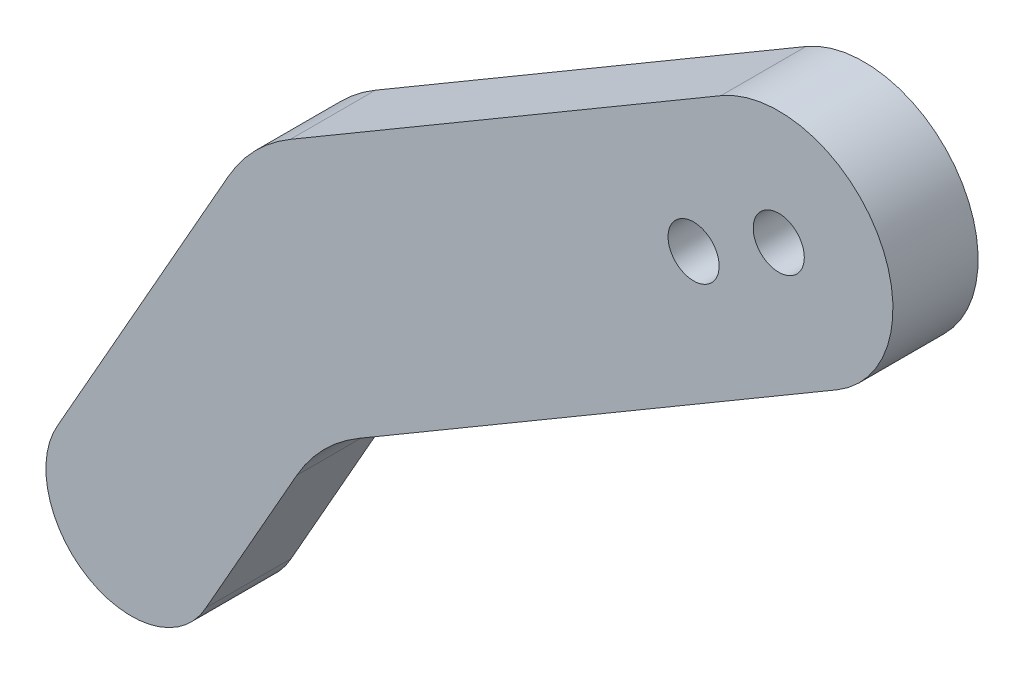
ISO-10303-21;
HEADER;
FILE_DESCRIPTION(('STEP AP214'),'2;1');
FILE_NAME('part.step','',(''),(''),'','','');
FILE_SCHEMA(('AUTOMOTIVE_DESIGN { 1 0 10303 214 1 1 1 1 }'));
ENDSEC;
DATA;
#1=APPLICATION_CONTEXT('core data for automotive mechanical design processes');
#2=APPLICATION_PROTOCOL_DEFINITION('international standard','automotive_design',2000,#1);
#3=PRODUCT_CONTEXT('',#1,'mechanical');
#4=PRODUCT('Part','Part','',(#3));
#5=PRODUCT_RELATED_PRODUCT_CATEGORY('part','',(#4));
#6=PRODUCT_DEFINITION_FORMATION('','',#4);
#7=PRODUCT_DEFINITION_CONTEXT('part definition',#1,'design');
#8=PRODUCT_DEFINITION('design','',#6,#7);
#9=PRODUCT_DEFINITION_SHAPE('','',#8);
#10=(LENGTH_UNIT() NAMED_UNIT(*) SI_UNIT(.MILLI.,.METRE.));
#11=(NAMED_UNIT(*) PLANE_ANGLE_UNIT() SI_UNIT($,.RADIAN.));
#12=(NAMED_UNIT(*) SI_UNIT($,.STERADIAN.) SOLID_ANGLE_UNIT());
#13=UNCERTAINTY_MEASURE_WITH_UNIT(LENGTH_MEASURE(1.E-05),#10,'distance_accuracy_value','');
#14=(GEOMETRIC_REPRESENTATION_CONTEXT(3) GLOBAL_UNCERTAINTY_ASSIGNED_CONTEXT((#13)) GLOBAL_UNIT_ASSIGNED_CONTEXT((#10,
#11,#12)) REPRESENTATION_CONTEXT('',''));
#15=CARTESIAN_POINT('',(0.,0.,0.));
#16=DIRECTION('',(0.,0.,1.));
#17=DIRECTION('',(1.,0.,0.));
#18=AXIS2_PLACEMENT_3D('',#15,#16,#17);
#19=CARTESIAN_POINT('',(8.69918007203384,-4.93196371380907,5.));
#20=DIRECTION('',(-0.869918007203384,0.493196371380907,0.));
#21=DIRECTION('',(-0.493196371380907,-0.869918007203384,0.));
#22=AXIS2_PLACEMENT_3D('',#19,#20,#21);
#23=PLANE('',#22);
#24=DIRECTION('',(0.493196371380907,0.869918007203384,0.));
#25=VECTOR('',#24,1.);
#26=CARTESIAN_POINT('',(8.69918007203384,-4.93196371380907,0.));
#27=LINE('',#26,#25);
#28=CARTESIAN_POINT('',(8.69918007203384,-4.93196371380907,0.));
#29=VERTEX_POINT('',#28);
#30=CARTESIAN_POINT('',(14.0358153914613,4.48099110832223,0.));
#31=VERTEX_POINT('',#30);
#32=EDGE_CURVE('E132',#29,#31,#27,.T.);
#33=ORIENTED_EDGE('',*,*,#32,.T.);
#34=DIRECTION('',(0.,0.,-1.));
#35=VECTOR('',#34,1.);
#36=CARTESIAN_POINT('',(14.0358153914613,4.48099110832223,5.));
#37=LINE('',#36,#35);
#38=CARTESIAN_POINT('',(14.0358153914613,4.48099110832223,5.));
#39=VERTEX_POINT('',#38);
#40=EDGE_CURVE('E11',#39,#31,#37,.T.);
#41=ORIENTED_EDGE('',*,*,#40,.F.);
#42=DIRECTION('',(0.493196371380907,0.869918007203384,0.));
#43=VECTOR('',#42,1.);
#44=CARTESIAN_POINT('',(8.69918007203384,-4.93196371380907,5.));
#45=LINE('',#44,#43);
#46=CARTESIAN_POINT('',(8.69918007203384,-4.93196371380907,5.));
#47=VERTEX_POINT('',#46);
#48=EDGE_CURVE('E151',#47,#39,#45,.T.);
#49=ORIENTED_EDGE('',*,*,#48,.F.);
#50=DIRECTION('',(0.,0.,-1.));
#51=VECTOR('',#50,1.);
#52=CARTESIAN_POINT('',(8.69918007203384,-4.93196371380907,5.));
#53=LINE('',#52,#51);
#54=EDGE_CURVE('E128',#47,#29,#53,.T.);
#55=ORIENTED_EDGE('',*,*,#54,.T.);
#56=EDGE_LOOP('',(#33,#41,#49,#55));
#57=FACE_BOUND('',#56,.T.);
#58=ADVANCED_FACE('F35',(#57),#23,.F.);
#59=CARTESIAN_POINT('',(22.7349954634952,-0.450972605486846,5.));
#60=DIRECTION('',(0.,0.,-1.));
#61=DIRECTION('',(-1.,0.,0.));
#62=AXIS2_PLACEMENT_3D('',#59,#60,#61);
#63=CYLINDRICAL_SURFACE('',#62,10.);
#64=CARTESIAN_POINT('',(22.7349954634952,-0.450972605486846,0.));
#65=DIRECTION('',(0.,0.,1.));
#66=DIRECTION('',(1.,0.,0.));
#67=AXIS2_PLACEMENT_3D('',#64,#65,#66);
#68=CIRCLE('',#67,10.);
#69=CARTESIAN_POINT('',(17.6672663859231,8.16982329723177,0.));
#70=VERTEX_POINT('',#69);
#71=EDGE_CURVE('E135',#31,#70,#68,.F.);
#72=ORIENTED_EDGE('',*,*,#71,.T.);
#73=DIRECTION('',(0.,0.,-1.));
#74=VECTOR('',#73,1.);
#75=CARTESIAN_POINT('',(17.6672663859231,8.16982329723177,5.));
#76=LINE('',#75,#74);
#77=CARTESIAN_POINT('',(17.6672663859231,8.16982329723177,5.));
#78=VERTEX_POINT('',#77);
#79=EDGE_CURVE('E44',#78,#70,#76,.T.);
#80=ORIENTED_EDGE('',*,*,#79,.F.);
#81=CARTESIAN_POINT('',(22.7349954634952,-0.450972605486846,5.));
#82=DIRECTION('',(0.,0.,1.));
#83=DIRECTION('',(1.,0.,0.));
#84=AXIS2_PLACEMENT_3D('',#81,#82,#83);
#85=CIRCLE('',#84,10.);
#86=EDGE_CURVE('E92',#39,#78,#85,.F.);
#87=ORIENTED_EDGE('',*,*,#86,.F.);
#88=ORIENTED_EDGE('',*,*,#40,.T.);
#89=EDGE_LOOP('',(#72,#80,#87,#88));
#90=FACE_BOUND('',#89,.T.);
#91=ADVANCED_FACE('F201',(#90),#63,.F.);
#92=CARTESIAN_POINT('',(0.968064993313359,-1.64679101826007,5.));
#93=DIRECTION('',(-0.506772907757211,0.862079590271862,0.));
#94=DIRECTION('',(-0.862079590271862,-0.506772907757211,0.));
#95=AXIS2_PLACEMENT_3D('',#92,#93,#94);
#96=PLANE('',#95);
#97=DIRECTION('',(0.862079590271862,0.506772907757211,0.));
#98=VECTOR('',#97,1.);
#99=CARTESIAN_POINT('',(0.968064993313359,-1.64679101826007,0.));
#100=LINE('',#99,#98);
#101=CARTESIAN_POINT('',(45.7260168629817,24.6641409075221,0.));
#102=VERTEX_POINT('',#101);
#103=EDGE_CURVE('E138',#70,#102,#100,.T.);
#104=ORIENTED_EDGE('',*,*,#103,.T.);
#105=DIRECTION('',(0.,0.,-1.));
#106=VECTOR('',#105,1.);
#107=CARTESIAN_POINT('',(45.7260168629817,24.6641409075221,5.));
#108=LINE('',#107,#106);
#109=CARTESIAN_POINT('',(45.7260168629817,24.6641409075221,5.));
#110=VERTEX_POINT('',#109);
#111=EDGE_CURVE('E157',#110,#102,#108,.T.);
#112=ORIENTED_EDGE('',*,*,#111,.F.);
#113=DIRECTION('',(0.862079590271862,0.506772907757211,0.));
#114=VECTOR('',#113,1.);
#115=CARTESIAN_POINT('',(0.968064993313359,-1.64679101826007,5.));
#116=LINE('',#115,#114);
#117=EDGE_CURVE('E174',#78,#110,#116,.T.);
#118=ORIENTED_EDGE('',*,*,#117,.F.);
#119=ORIENTED_EDGE('',*,*,#79,.T.);
#120=EDGE_LOOP('',(#104,#112,#118,#119));
#121=FACE_BOUND('',#120,.T.);
#122=ADVANCED_FACE('F205',(#121),#96,.F.);
#123=CARTESIAN_POINT('',(42.3280401467211,30.4444940607153,5.));
#124=DIRECTION('',(0.,0.,-1.));
#125=DIRECTION('',(-1.,0.,0.));
#126=AXIS2_PLACEMENT_3D('',#123,#124,#125);
#127=CYLINDRICAL_SURFACE('',#126,6.70512701892218);
#128=CARTESIAN_POINT('',(42.3280401467211,30.4444940607153,0.));
#129=DIRECTION('',(0.,0.,1.));
#130=DIRECTION('',(1.,0.,0.));
#131=AXIS2_PLACEMENT_3D('',#128,#129,#130);
#132=CIRCLE('',#131,6.70512701892218);
#133=CARTESIAN_POINT('',(38.9300634304605,36.2248472139085,0.));
#134=VERTEX_POINT('',#133);
#135=EDGE_CURVE('E141',#134,#102,#132,.F.);
#136=ORIENTED_EDGE('',*,*,#135,.F.);
#137=DIRECTION('',(0.,0.,-1.));
#138=VECTOR('',#137,1.);
#139=CARTESIAN_POINT('',(38.9300634304605,36.2248472139085,5.));
#140=LINE('',#139,#138);
#141=CARTESIAN_POINT('',(38.9300634304605,36.2248472139085,5.));
#142=VERTEX_POINT('',#141);
#143=EDGE_CURVE('E155',#142,#134,#140,.T.);
#144=ORIENTED_EDGE('',*,*,#143,.F.);
#145=CARTESIAN_POINT('',(42.3280401467211,30.4444940607153,5.));
#146=DIRECTION('',(0.,0.,1.));
#147=DIRECTION('',(1.,0.,0.));
#148=AXIS2_PLACEMENT_3D('',#145,#146,#147);
#149=CIRCLE('',#148,6.70512701892218);
#150=EDGE_CURVE('E176',#142,#110,#149,.F.);
#151=ORIENTED_EDGE('',*,*,#150,.T.);
#152=ORIENTED_EDGE('',*,*,#111,.T.);
#153=EDGE_LOOP('',(#136,#144,#151,#152));
#154=FACE_BOUND('',#153,.T.);
#155=ADVANCED_FACE('F209',(#154),#127,.T.);
#156=CARTESIAN_POINT('',(-5.82788843920793,9.91391528812644,5.));
#157=DIRECTION('',(-0.50677290775721,0.862079590271863,0.));
#158=DIRECTION('',(-0.862079590271863,-0.50677290775721,0.));
#159=AXIS2_PLACEMENT_3D('',#156,#157,#158);
#160=PLANE('',#159);
#161=DIRECTION('',(0.862079590271863,0.50677290775721,0.));
#162=VECTOR('',#161,1.);
#163=CARTESIAN_POINT('',(-5.82788843920793,9.91391528812644,0.));
#164=LINE('',#163,#162);
#165=CARTESIAN_POINT('',(13.6534518420079,21.366008079473,0.));
#166=VERTEX_POINT('',#165);
#167=EDGE_CURVE('E144',#166,#134,#164,.T.);
#168=ORIENTED_EDGE('',*,*,#167,.F.);
#169=DIRECTION('',(0.,0.,-1.));
#170=VECTOR('',#169,1.);
#171=CARTESIAN_POINT('',(13.6534518420079,21.366008079473,5.));
#172=LINE('',#171,#170);
#173=CARTESIAN_POINT('',(13.6534518420079,21.366008079473,5.));
#174=VERTEX_POINT('',#173);
#175=EDGE_CURVE('E117',#174,#166,#172,.T.);
#176=ORIENTED_EDGE('',*,*,#175,.F.);
#177=DIRECTION('',(0.862079590271863,0.50677290775721,0.));
#178=VECTOR('',#177,1.);
#179=CARTESIAN_POINT('',(-5.82788843920793,9.91391528812644,5.));
#180=LINE('',#179,#178);
#181=EDGE_CURVE('E124',#174,#142,#180,.T.);
#182=ORIENTED_EDGE('',*,*,#181,.T.);
#183=ORIENTED_EDGE('',*,*,#143,.T.);
#184=EDGE_LOOP('',(#168,#176,#182,#183));
#185=FACE_BOUND('',#184,.T.);
#186=ADVANCED_FACE('F180',(#185),#160,.T.);
#187=CARTESIAN_POINT('',(18.72118091958,12.7452121767544,5.));
#188=DIRECTION('',(0.,0.,-1.));
#189=DIRECTION('',(-1.,0.,0.));
#190=AXIS2_PLACEMENT_3D('',#187,#188,#189);
#191=CYLINDRICAL_SURFACE('',#190,10.);
#192=CARTESIAN_POINT('',(18.72118091958,12.7452121767544,0.));
#193=DIRECTION('',(0.,0.,1.));
#194=DIRECTION('',(1.,0.,0.));
#195=AXIS2_PLACEMENT_3D('',#192,#193,#194);
#196=CIRCLE('',#195,10.);
#197=CARTESIAN_POINT('',(10.0220008475461,17.6771758905634,0.));
#198=VERTEX_POINT('',#197);
#199=EDGE_CURVE('E112',#198,#166,#196,.F.);
#200=ORIENTED_EDGE('',*,*,#199,.F.);
#201=DIRECTION('',(0.,0.,-1.));
#202=VECTOR('',#201,1.);
#203=CARTESIAN_POINT('',(10.0220008475461,17.6771758905634,5.));
#204=LINE('',#203,#202);
#205=CARTESIAN_POINT('',(10.0220008475461,17.6771758905634,5.));
#206=VERTEX_POINT('',#205);
#207=EDGE_CURVE('E107',#206,#198,#204,.T.);
#208=ORIENTED_EDGE('',*,*,#207,.F.);
#209=CARTESIAN_POINT('',(18.72118091958,12.7452121767544,5.));
#210=DIRECTION('',(0.,0.,1.));
#211=DIRECTION('',(1.,0.,0.));
#212=AXIS2_PLACEMENT_3D('',#209,#210,#211);
#213=CIRCLE('',#212,10.);
#214=EDGE_CURVE('E110',#206,#174,#213,.F.);
#215=ORIENTED_EDGE('',*,*,#214,.T.);
#216=ORIENTED_EDGE('',*,*,#175,.T.);
#217=EDGE_LOOP('',(#200,#208,#215,#216));
#218=FACE_BOUND('',#217,.T.);
#219=ADVANCED_FACE('F109',(#218),#191,.T.);
#220=CARTESIAN_POINT('',(0.,0.,5.));
#221=DIRECTION('',(-0.869918007203384,0.493196371380907,0.));
#222=DIRECTION('',(-0.493196371380907,-0.869918007203384,0.));
#223=AXIS2_PLACEMENT_3D('',#220,#221,#222);
#224=PLANE('',#223);
#225=DIRECTION('',(0.493196371380907,0.869918007203384,0.));
#226=VECTOR('',#225,1.);
#227=CARTESIAN_POINT('',(0.,0.,0.));
#228=LINE('',#227,#226);
#229=CARTESIAN_POINT('',(0.,0.,0.));
#230=VERTEX_POINT('',#229);
#231=EDGE_CURVE('E148',#230,#198,#228,.T.);
#232=ORIENTED_EDGE('',*,*,#231,.F.);
#233=DIRECTION('',(0.,0.,-1.));
#234=VECTOR('',#233,1.);
#235=CARTESIAN_POINT('',(0.,0.,5.));
#236=LINE('',#235,#234);
#237=CARTESIAN_POINT('',(0.,0.,5.));
#238=VERTEX_POINT('',#237);
#239=EDGE_CURVE('E81',#238,#230,#236,.T.);
#240=ORIENTED_EDGE('',*,*,#239,.F.);
#241=DIRECTION('',(0.493196371380907,0.869918007203384,0.));
#242=VECTOR('',#241,1.);
#243=CARTESIAN_POINT('',(0.,0.,5.));
#244=LINE('',#243,#242);
#245=EDGE_CURVE('E121',#238,#206,#244,.T.);
#246=ORIENTED_EDGE('',*,*,#245,.T.);
#247=ORIENTED_EDGE('',*,*,#207,.T.);
#248=EDGE_LOOP('',(#232,#240,#246,#247));
#249=FACE_BOUND('',#248,.T.);
#250=ADVANCED_FACE('F126',(#249),#224,.T.);
#251=CARTESIAN_POINT('',(4.30532765313558,-2.54405348545767,5.));
#252=DIRECTION('',(0.,0.,-1.));
#253=DIRECTION('',(-1.,0.,0.));
#254=AXIS2_PLACEMENT_3D('',#251,#252,#253);
#255=CYLINDRICAL_SURFACE('',#254,5.00080536891042);
#256=CARTESIAN_POINT('',(4.30532765313558,-2.54405348545767,0.));
#257=DIRECTION('',(0.,0.,1.));
#258=DIRECTION('',(1.,0.,0.));
#259=AXIS2_PLACEMENT_3D('',#256,#257,#258);
#260=CIRCLE('',#259,5.00080536891042);
#261=EDGE_CURVE('E84',#230,#29,#260,.T.);
#262=ORIENTED_EDGE('',*,*,#261,.T.);
#263=ORIENTED_EDGE('',*,*,#54,.F.);
#264=CARTESIAN_POINT('',(4.30532765313558,-2.54405348545767,5.));
#265=DIRECTION('',(0.,0.,1.));
#266=DIRECTION('',(1.,0.,0.));
#267=AXIS2_PLACEMENT_3D('',#264,#265,#266);
#268=CIRCLE('',#267,5.00080536891042);
#269=EDGE_CURVE('E53',#238,#47,#268,.T.);
#270=ORIENTED_EDGE('',*,*,#269,.F.);
#271=ORIENTED_EDGE('',*,*,#239,.T.);
#272=EDGE_LOOP('',(#262,#263,#270,#271));
#273=FACE_BOUND('',#272,.T.);
#274=ADVANCED_FACE('F189',(#273),#255,.T.);
#275=CARTESIAN_POINT('',(0.,0.,5.));
#276=DIRECTION('',(0.,0.,1.));
#277=DIRECTION('',(1.,0.,0.));
#278=AXIS2_PLACEMENT_3D('',#275,#276,#277);
#279=PLANE('',#278);
#280=CARTESIAN_POINT('',(37.3280401467211,27.5052474211017,5.));
#281=DIRECTION('',(0.,0.,1.));
#282=DIRECTION('',(1.,0.,0.));
#283=AXIS2_PLACEMENT_3D('',#280,#281,#282);
#284=CIRCLE('',#283,1.5);
#285=CARTESIAN_POINT('',(38.8280401467211,27.5052474211017,5.));
#286=VERTEX_POINT('',#285);
#287=EDGE_CURVE('E169',#286,#286,#284,.T.);
#288=ORIENTED_EDGE('',*,*,#287,.F.);
#289=EDGE_LOOP('',(#288));
#290=FACE_BOUND('',#289,.T.);
#291=CARTESIAN_POINT('',(42.3280401467211,30.4444940607153,5.));
#292=DIRECTION('',(0.,0.,1.));
#293=DIRECTION('',(1.,0.,0.));
#294=AXIS2_PLACEMENT_3D('',#291,#292,#293);
#295=CIRCLE('',#294,1.5);
#296=CARTESIAN_POINT('',(43.8280401467211,30.4444940607153,5.));
#297=VERTEX_POINT('',#296);
#298=EDGE_CURVE('E161',#297,#297,#295,.T.);
#299=ORIENTED_EDGE('',*,*,#298,.F.);
#300=EDGE_LOOP('',(#299));
#301=FACE_BOUND('',#300,.T.);
#302=ORIENTED_EDGE('',*,*,#48,.T.);
#303=ORIENTED_EDGE('',*,*,#86,.T.);
#304=ORIENTED_EDGE('',*,*,#117,.T.);
#305=ORIENTED_EDGE('',*,*,#150,.F.);
#306=ORIENTED_EDGE('',*,*,#181,.F.);
#307=ORIENTED_EDGE('',*,*,#214,.F.);
#308=ORIENTED_EDGE('',*,*,#245,.F.);
#309=ORIENTED_EDGE('',*,*,#269,.T.);
#310=EDGE_LOOP('',(#302,#303,#304,#305,#306,#307,#308,#309));
#311=FACE_BOUND('',#310,.T.);
#312=ADVANCED_FACE('F120',(#290,#301,#311),#279,.T.);
#313=CARTESIAN_POINT('',(0.,0.,0.));
#314=DIRECTION('',(0.,0.,1.));
#315=DIRECTION('',(1.,0.,0.));
#316=AXIS2_PLACEMENT_3D('',#313,#314,#315);
#317=PLANE('',#316);
#318=CARTESIAN_POINT('',(37.3280401467211,27.5052474211017,0.));
#319=DIRECTION('',(0.,0.,1.));
#320=DIRECTION('',(1.,0.,0.));
#321=AXIS2_PLACEMENT_3D('',#318,#319,#320);
#322=CIRCLE('',#321,1.5);
#323=CARTESIAN_POINT('',(38.8280401467211,27.5052474211017,0.));
#324=VERTEX_POINT('',#323);
#325=EDGE_CURVE('E38',#324,#324,#322,.T.);
#326=ORIENTED_EDGE('',*,*,#325,.T.);
#327=EDGE_LOOP('',(#326));
#328=FACE_BOUND('',#327,.T.);
#329=CARTESIAN_POINT('',(42.3280401467211,30.4444940607153,0.));
#330=DIRECTION('',(0.,0.,1.));
#331=DIRECTION('',(1.,0.,0.));
#332=AXIS2_PLACEMENT_3D('',#329,#330,#331);
#333=CIRCLE('',#332,1.5);
#334=CARTESIAN_POINT('',(43.8280401467211,30.4444940607153,0.));
#335=VERTEX_POINT('',#334);
#336=EDGE_CURVE('E136',#335,#335,#333,.T.);
#337=ORIENTED_EDGE('',*,*,#336,.T.);
#338=EDGE_LOOP('',(#337));
#339=FACE_BOUND('',#338,.T.);
#340=ORIENTED_EDGE('',*,*,#32,.F.);
#341=ORIENTED_EDGE('',*,*,#261,.F.);
#342=ORIENTED_EDGE('',*,*,#231,.T.);
#343=ORIENTED_EDGE('',*,*,#199,.T.);
#344=ORIENTED_EDGE('',*,*,#167,.T.);
#345=ORIENTED_EDGE('',*,*,#135,.T.);
#346=ORIENTED_EDGE('',*,*,#103,.F.);
#347=ORIENTED_EDGE('',*,*,#71,.F.);
#348=EDGE_LOOP('',(#340,#341,#342,#343,#344,#345,#346,#347));
#349=FACE_BOUND('',#348,.T.);
#350=ADVANCED_FACE('F184',(#328,#339,#349),#317,.F.);
#351=CARTESIAN_POINT('',(42.3280401467211,30.4444940607153,-2.));
#352=DIRECTION('',(0.,0.,1.));
#353=DIRECTION('',(1.,0.,0.));
#354=AXIS2_PLACEMENT_3D('',#351,#352,#353);
#355=CYLINDRICAL_SURFACE('',#354,1.5);
#356=ORIENTED_EDGE('',*,*,#298,.T.);
#357=EDGE_LOOP('',(#356));
#358=FACE_BOUND('',#357,.T.);
#359=ORIENTED_EDGE('',*,*,#336,.F.);
#360=EDGE_LOOP('',(#359));
#361=FACE_BOUND('',#360,.T.);
#362=ADVANCED_FACE('F246',(#358,#361),#355,.F.);
#363=CARTESIAN_POINT('',(37.3280401467211,27.5052474211017,-2.));
#364=DIRECTION('',(0.,0.,1.));
#365=DIRECTION('',(1.,0.,0.));
#366=AXIS2_PLACEMENT_3D('',#363,#364,#365);
#367=CYLINDRICAL_SURFACE('',#366,1.5);
#368=ORIENTED_EDGE('',*,*,#287,.T.);
#369=EDGE_LOOP('',(#368));
#370=FACE_BOUND('',#369,.T.);
#371=ORIENTED_EDGE('',*,*,#325,.F.);
#372=EDGE_LOOP('',(#371));
#373=FACE_BOUND('',#372,.T.);
#374=ADVANCED_FACE('F255',(#370,#373),#367,.F.);
#375=CLOSED_SHELL('',(#58,#91,#122,#155,#186,#219,#250,#274,#312,#350,#362,#374));
#376=MANIFOLD_SOLID_BREP('B2',#375);
#377=ADVANCED_BREP_SHAPE_REPRESENTATION('',(#18,#376),#14);
#378=SHAPE_DEFINITION_REPRESENTATION(#9,#377);
ENDSEC;
END-ISO-10303-21;
